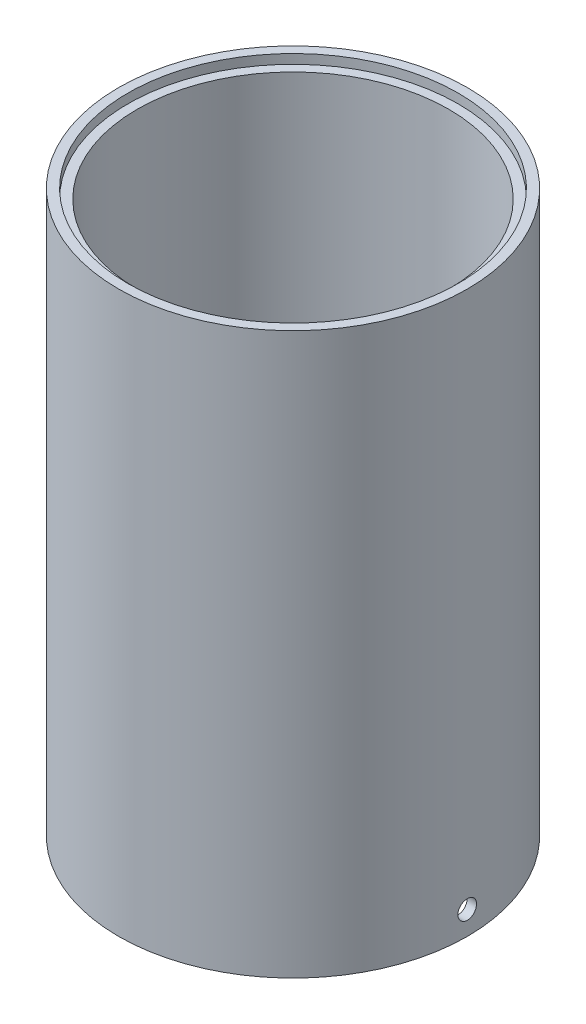
ISO-10303-21;
HEADER;
FILE_DESCRIPTION(('STEP AP214'),'2;1');
FILE_NAME('part.step','',(''),(''),'','','');
FILE_SCHEMA(('AUTOMOTIVE_DESIGN { 1 0 10303 214 1 1 1 1 }'));
ENDSEC;
DATA;
#1=APPLICATION_CONTEXT('core data for automotive mechanical design processes');
#2=APPLICATION_PROTOCOL_DEFINITION('international standard','automotive_design',2000,#1);
#3=PRODUCT_CONTEXT('',#1,'mechanical');
#4=PRODUCT('Part','Part','',(#3));
#5=PRODUCT_RELATED_PRODUCT_CATEGORY('part','',(#4));
#6=PRODUCT_DEFINITION_FORMATION('','',#4);
#7=PRODUCT_DEFINITION_CONTEXT('part definition',#1,'design');
#8=PRODUCT_DEFINITION('design','',#6,#7);
#9=PRODUCT_DEFINITION_SHAPE('','',#8);
#10=(LENGTH_UNIT() NAMED_UNIT(*) SI_UNIT(.MILLI.,.METRE.));
#11=(NAMED_UNIT(*) PLANE_ANGLE_UNIT() SI_UNIT($,.RADIAN.));
#12=(NAMED_UNIT(*) SI_UNIT($,.STERADIAN.) SOLID_ANGLE_UNIT());
#13=UNCERTAINTY_MEASURE_WITH_UNIT(LENGTH_MEASURE(1.E-05),#10,'distance_accuracy_value','');
#14=(GEOMETRIC_REPRESENTATION_CONTEXT(3) GLOBAL_UNCERTAINTY_ASSIGNED_CONTEXT((#13)) GLOBAL_UNIT_ASSIGNED_CONTEXT((#10,
#11,#12)) REPRESENTATION_CONTEXT('',''));
#15=CARTESIAN_POINT('',(0.,0.,0.));
#16=DIRECTION('',(0.,0.,1.));
#17=DIRECTION('',(1.,0.,0.));
#18=AXIS2_PLACEMENT_3D('',#15,#16,#17);
#19=CARTESIAN_POINT('',(0.,180.,0.));
#20=DIRECTION('',(0.,-1.,0.));
#21=DIRECTION('',(0.,0.,-1.));
#22=AXIS2_PLACEMENT_3D('',#19,#20,#21);
#23=CYLINDRICAL_SURFACE('',#22,56.);
#24=CARTESIAN_POINT('',(0.,180.,0.));
#25=DIRECTION('',(0.,1.,0.));
#26=DIRECTION('',(1.,0.,0.));
#27=AXIS2_PLACEMENT_3D('',#24,#25,#26);
#28=CIRCLE('',#27,56.);
#29=CARTESIAN_POINT('',(56.,180.,0.));
#30=VERTEX_POINT('',#29);
#31=EDGE_CURVE('E11',#30,#30,#28,.T.);
#32=ORIENTED_EDGE('',*,*,#31,.F.);
#33=EDGE_LOOP('',(#32));
#34=FACE_BOUND('',#33,.T.);
#35=CARTESIAN_POINT('',(0.,0.,0.));
#36=DIRECTION('',(0.,1.,0.));
#37=DIRECTION('',(1.,0.,0.));
#38=AXIS2_PLACEMENT_3D('',#35,#36,#37);
#39=CIRCLE('',#38,56.);
#40=CARTESIAN_POINT('',(56.,0.,0.));
#41=VERTEX_POINT('',#40);
#42=EDGE_CURVE('E54',#41,#41,#39,.T.);
#43=ORIENTED_EDGE('',*,*,#42,.T.);
#44=EDGE_LOOP('',(#43));
#45=FACE_BOUND('',#44,.T.);
#46=CARTESIAN_POINT('',(55.9195851200633,7.50000000000001,-3.));
#47=CARTESIAN_POINT('',(55.9195861991394,7.6683815451525,-2.99999257436234));
#48=CARTESIAN_POINT('',(55.9203538255063,7.83688210477019,-2.98577620779765));
#49=CARTESIAN_POINT('',(55.923341880392,8.16923372610874,-2.92926656847776));
#50=CARTESIAN_POINT('',(55.92556401517,8.33307909107233,-2.88694031964308));
#51=CARTESIAN_POINT('',(55.9312086591393,8.65125785475281,-2.77542728637137));
#52=CARTESIAN_POINT('',(55.9346305506156,8.80559610038525,-2.70625432246179));
#53=CARTESIAN_POINT('',(55.942288352116,9.10042921760216,-2.54303294824952));
#54=CARTESIAN_POINT('',(55.9465240714447,9.24092732055251,-2.44899036343413));
#55=CARTESIAN_POINT('',(55.9553377569819,9.50429373415512,-2.23858035887218));
#56=CARTESIAN_POINT('',(55.9599160617056,9.62714424746555,-2.12219067489981));
#57=CARTESIAN_POINT('',(55.9688958576349,9.85157628979778,-1.87043532175811));
#58=CARTESIAN_POINT('',(55.973297341576,9.95315694569171,-1.73506887397307));
#59=CARTESIAN_POINT('',(55.9814302152055,10.1322164281826,-1.44910726081878));
#60=CARTESIAN_POINT('',(55.9851612120952,10.2096811460079,-1.29850324888059));
#61=CARTESIAN_POINT('',(55.9915292180784,10.3382193297527,-0.986403819484196));
#62=CARTESIAN_POINT('',(55.9941662363528,10.3892930171481,-0.824908493439664));
#63=CARTESIAN_POINT('',(55.9980468447449,10.4635516566096,-0.495776651355437));
#64=CARTESIAN_POINT('',(55.9992917831112,10.4867635947705,-0.328146240058142));
#65=CARTESIAN_POINT('',(56.0002524712738,10.5047231313901,0.00863597379350962));
#66=CARTESIAN_POINT('',(55.9999682344735,10.49947097934,0.177787762999836));
#67=CARTESIAN_POINT('',(55.9979037343563,10.4606737809639,0.512628390747918));
#68=CARTESIAN_POINT('',(55.9961250066397,10.4271577758205,0.67832060500151));
#69=CARTESIAN_POINT('',(55.9912736197455,10.3328292989353,1.00172370948807));
#70=CARTESIAN_POINT('',(55.9882009545541,10.2720167003229,1.15943456262103));
#71=CARTESIAN_POINT('',(55.9811051229663,10.1247882299308,1.46249155238675));
#72=CARTESIAN_POINT('',(55.977081466258,10.0383591449501,1.60783125795446));
#73=CARTESIAN_POINT('',(55.9685367001476,9.84236074501021,1.88195001825096));
#74=CARTESIAN_POINT('',(55.964015586684,9.73279124111113,2.01072893774837));
#75=CARTESIAN_POINT('',(55.9549782612421,9.49345814435465,2.24823997219743));
#76=CARTESIAN_POINT('',(55.9504620625585,9.36366935291626,2.35694669738055));
#77=CARTESIAN_POINT('',(55.9419494133546,9.08767036766242,2.55103192249507));
#78=CARTESIAN_POINT('',(55.9379529629883,8.94146016897743,2.63641041550876));
#79=CARTESIAN_POINT('',(55.9309309332028,8.63675320028559,2.78141348552107));
#80=CARTESIAN_POINT('',(55.9279053909134,8.47825596068175,2.84103707762322));
#81=CARTESIAN_POINT('',(55.9231677640204,8.15348111024215,2.93282074287968));
#82=CARTESIAN_POINT('',(55.921455668076,7.98720356659842,2.96498105316545));
#83=CARTESIAN_POINT('',(55.9195401137446,7.65180936742008,3.00089377905491));
#84=CARTESIAN_POINT('',(55.9193347831588,7.48269649696021,3.00468144859401));
#85=CARTESIAN_POINT('',(55.9204510263271,7.14623765194812,2.98383340353376));
#86=CARTESIAN_POINT('',(55.9217725942712,6.97889167067525,2.95919779708634));
#87=CARTESIAN_POINT('',(55.9257919777113,6.65081614369008,2.8822317655449));
#88=CARTESIAN_POINT('',(55.9284889900035,6.49008279560059,2.82991750299585));
#89=CARTESIAN_POINT('',(55.9349546138976,6.1796779705534,2.69909552945861));
#90=CARTESIAN_POINT('',(55.9387232326293,6.03000656720364,2.62058764419305));
#91=CARTESIAN_POINT('',(55.9469118819793,5.74581212888393,2.43951659852235));
#92=CARTESIAN_POINT('',(55.9513325518547,5.61130419079465,2.33692977260415));
#93=CARTESIAN_POINT('',(55.9603248252139,5.36140678800475,2.11064744872912));
#94=CARTESIAN_POINT('',(55.964896429797,5.24601746259857,1.98695179699088));
#95=CARTESIAN_POINT('',(55.9736808084205,5.0375141345431,1.72181158632764));
#96=CARTESIAN_POINT('',(55.9778932126501,4.94442291451493,1.58034909749391));
#97=CARTESIAN_POINT('',(55.9854791775326,4.78331410145407,1.2837813163001));
#98=CARTESIAN_POINT('',(55.9888527422391,4.71529638724976,1.12867608987518));
#99=CARTESIAN_POINT('',(55.9943790793412,4.60630514274531,0.809310190853239));
#100=CARTESIAN_POINT('',(55.9965325077103,4.56531707873343,0.645054490034571));
#101=CARTESIAN_POINT('',(55.9993785046898,4.5115010486498,0.311980777816435));
#102=CARTESIAN_POINT('',(56.0000710831541,4.4986728926296,0.143162797198919));
#103=CARTESIAN_POINT('',(55.9999173715325,4.50154262353094,-0.194017406750738));
#104=CARTESIAN_POINT('',(55.9990730080731,4.51720479651206,-0.362379936090604));
#105=CARTESIAN_POINT('',(55.9959442446222,4.57653670675272,-0.694081407141251));
#106=CARTESIAN_POINT('',(55.9936598419604,4.62020649594721,-0.857420339536107));
#107=CARTESIAN_POINT('',(55.9879079439819,4.73430647480333,-1.17444486332068));
#108=CARTESIAN_POINT('',(55.9844404438054,4.8047367743896,-1.328130415054));
#109=CARTESIAN_POINT('',(55.9767121472276,4.97035274796358,-1.62149846000883));
#110=CARTESIAN_POINT('',(55.9724513741829,5.06553769312265,-1.76118136532988));
#111=CARTESIAN_POINT('',(55.963609839191,5.27809033864153,-2.02275839813577));
#112=CARTESIAN_POINT('',(55.9590287172377,5.39548325716799,-2.1446320207553));
#113=CARTESIAN_POINT('',(55.9500654034362,5.64909680451288,-2.36698111769812));
#114=CARTESIAN_POINT('',(55.9456832607393,5.78532205199465,-2.46745132738854));
#115=CARTESIAN_POINT('',(55.9376088919649,6.07285317243841,-2.64419587633827));
#116=CARTESIAN_POINT('',(55.9339173833432,6.22417448035095,-2.72044511070719));
#117=CARTESIAN_POINT('',(55.9276517302591,6.53737861942747,-2.84636327355684));
#118=CARTESIAN_POINT('',(55.9250762695871,6.69924874912649,-2.89606352873334));
#119=CARTESIAN_POINT('',(55.9220135445721,6.96843382819217,-2.95446761703488));
#120=CARTESIAN_POINT('',(55.9211069155477,7.07400611348309,-2.97152038773579));
#121=CARTESIAN_POINT('',(55.9198923612505,7.28636962832107,-2.99428892939189));
#122=CARTESIAN_POINT('',(55.9195844353827,7.39316085665667,-3.00000471161353));
#123=CARTESIAN_POINT('',(55.9195851200633,7.50000000000001,-3.));
#124=B_SPLINE_CURVE_WITH_KNOTS('',3,(#46,#47,#48,#49,#50,#51,#52,#53,#54,#55,#56,#57,#58,#59,
#60,#61,#62,#63,#64,#65,#66,#67,#68,#69,#70,#71,#72,#73,#74,#75,#76,#77,#78,#79,#80,#81,#82,#83,
#84,#85,#86,#87,#88,#89,#90,#91,#92,#93,#94,#95,#96,#97,#98,#99,#100,#101,#102,#103,#104,#105,
#106,#107,#108,#109,#110,#111,#112,#113,#114,#115,#116,#117,#118,#119,#120,#121,#122,#123),
.UNSPECIFIED.,.T.,.F.,(4,2,2,2,2,2,2,2,2,2,2,2,2,2,2,2,2,2,2,2,2,2,2,2,2,2,2,2,2,2,2,2,2,2,2,2,
2,2,4),(0.,0.504754624819107,1.01010243247589,1.51519043445124,2.02016022869491,
2.52563575540154,3.03113202781804,3.53692348206394,4.04271069159674,4.54800761375094,
5.05330010692592,5.55807404245851,6.06285032413203,6.56788742816513,7.0729286559475,
7.57860440960718,8.08428031321878,8.58997555273606,9.09566642578832,9.60072885697861,
10.1057893663884,10.6105552780974,11.1153245482969,11.620592013864,12.1258631605481,
12.631648376111,13.1374311473558,13.6429417394322,14.1484489216521,14.6533228639467,
15.1581977424398,15.6630746948393,16.1679367842857,16.6733756468204,17.1789386898066,
17.6850240487263,18.1905109213786,18.5107812054973,18.8310511713384),.UNSPECIFIED.);
#125=CARTESIAN_POINT('',(55.9195851200633,7.50000000000001,-3.));
#126=VERTEX_POINT('',#125);
#127=EDGE_CURVE('E91',#126,#126,#124,.T.);
#128=ORIENTED_EDGE('',*,*,#127,.F.);
#129=EDGE_LOOP('',(#128));
#130=FACE_BOUND('',#129,.T.);
#131=CARTESIAN_POINT('',(-56.,4.50000000000001,0.));
#132=CARTESIAN_POINT('',(-55.9999989266956,4.50000742546018,0.168381740663101));
#133=CARTESIAN_POINT('',(-55.9992324299297,4.5142238239215,0.336882495127751));
#134=CARTESIAN_POINT('',(-55.9962484107726,4.57073360146409,0.669234521329351));
#135=CARTESIAN_POINT('',(-55.9940291842471,4.61305995596199,0.833080096461581));
#136=CARTESIAN_POINT('',(-55.9883908518685,4.72457329837756,1.15125930440666));
#137=CARTESIAN_POINT('',(-55.9849723632475,4.79374647080814,1.30559778235477));
#138=CARTESIAN_POINT('',(-55.9773203742027,4.95696833596216,1.60043128828011));
#139=CARTESIAN_POINT('',(-55.9730870647231,5.05101120268104,1.74092954791739));
#140=CARTESIAN_POINT('',(-55.9642761671544,5.26142149107134,2.00429578235304));
#141=CARTESIAN_POINT('',(-55.9596982394627,5.37781111408086,2.12714600997348));
#142=CARTESIAN_POINT('',(-55.9507169851454,5.62956622564621,2.3515775015606));
#143=CARTESIAN_POINT('',(-55.9463136657007,5.76493249359363,2.45315789152424));
#144=CARTESIAN_POINT('',(-55.9381757028364,6.05089395140478,2.63221709767586));
#145=CARTESIAN_POINT('',(-55.9344414527646,6.20149801874268,2.70968175576443));
#146=CARTESIAN_POINT('',(-55.9280669591603,6.51359756860502,2.83821981375265));
#147=CARTESIAN_POINT('',(-55.9254267064169,6.67509295941716,2.88929343585127));
#148=CARTESIAN_POINT('',(-55.9215410710889,7.00422499076189,2.963551936281));
#149=CARTESIAN_POINT('',(-55.9202943391026,7.17185552761695,2.98676379588057));
#150=CARTESIAN_POINT('',(-55.9193322895748,7.50863798663921,3.00472313188408));
#151=CARTESIAN_POINT('',(-55.9196169585658,7.67778989541398,2.99947085860962));
#152=CARTESIAN_POINT('',(-55.9216843553835,8.01262998346627,2.96067347019866));
#153=CARTESIAN_POINT('',(-55.9234655390625,8.17832155268841,2.92715751822052));
#154=CARTESIAN_POINT('',(-55.9283227839895,8.50172339449743,2.83282937199361));
#155=CARTESIAN_POINT('',(-55.9313988513122,8.65943362963734,2.77201704968848));
#156=CARTESIAN_POINT('',(-55.9385009557555,8.96248987763196,2.62478914748724));
#157=CARTESIAN_POINT('',(-55.9425274853266,9.107829427734,2.53836028927506));
#158=CARTESIAN_POINT('',(-55.9510762029006,9.3819479736454,2.3423623712364));
#159=CARTESIAN_POINT('',(-55.9555983949474,9.51072683432419,2.23279312261012));
#160=CARTESIAN_POINT('',(-55.9646356235277,9.74823816417274,1.99346020460403));
#161=CARTESIAN_POINT('',(-55.9691506438853,9.85694519183304,1.86367128512431));
#162=CARTESIAN_POINT('',(-55.9776591810424,10.0510309658837,1.58767193676549));
#163=CARTESIAN_POINT('',(-55.9816526977009,10.1364097059643,1.44146150344477));
#164=CARTESIAN_POINT('',(-55.9886683805235,10.2814129528668,1.13675447615615));
#165=CARTESIAN_POINT('',(-55.9916905124501,10.3410365519473,0.978257449378708));
#166=CARTESIAN_POINT('',(-55.9964223518673,10.4328202965961,0.65348306079393));
#167=CARTESIAN_POINT('',(-55.9981320706297,10.4649806780345,0.487205765820988));
#168=CARTESIAN_POINT('',(-56.0000449536912,10.5008936715059,0.151811674387064));
#169=CARTESIAN_POINT('',(-56.0002499840264,10.5046814698568,-0.0173013442608167));
#170=CARTESIAN_POINT('',(-55.9991353406058,10.4838336295056,-0.353760516768518));
#171=CARTESIAN_POINT('',(-55.9978156726522,10.4591980989672,-0.521106677349591));
#172=CARTESIAN_POINT('',(-55.9938014512955,10.3822320388835,-0.849183056143772));
#173=CARTESIAN_POINT('',(-55.9911076965175,10.3299175957813,-1.00991705879575));
#174=CARTESIAN_POINT('',(-55.9846485221795,10.1990950414225,-1.32032311287043));
#175=CARTESIAN_POINT('',(-55.9808830955325,10.1205867569441,-1.46999509113118));
#176=CARTESIAN_POINT('',(-55.9726993891994,9.93951513066038,-1.75418990890715));
#177=CARTESIAN_POINT('',(-55.9682804715678,9.83692822491065,-1.88869771627319));
#178=CARTESIAN_POINT('',(-55.9592894782092,9.61064581530907,-2.13859481801946));
#179=CARTESIAN_POINT('',(-55.9547174013622,9.48695015706042,-2.253983972547));
#180=CARTESIAN_POINT('',(-55.9459300593535,9.22181002348173,-2.46248694879148));
#181=CARTESIAN_POINT('',(-55.9417151619369,9.08034761890842,-2.55557798861543));
#182=CARTESIAN_POINT('',(-55.9341232811861,8.78378005263501,-2.71668648512854));
#183=CARTESIAN_POINT('',(-55.9307462938029,8.62867495686382,-2.78470406297808));
#184=CARTESIAN_POINT('',(-55.9252136798895,8.30930896119202,-2.89369521337941));
#185=CARTESIAN_POINT('',(-55.9230573997392,8.14505301290993,-2.9346832606646));
#186=CARTESIAN_POINT('',(-55.9202075289065,7.81197878019857,-2.98849917338099));
#187=CARTESIAN_POINT('',(-55.9195139282897,7.64316052676376,-3.00132723007115));
#188=CARTESIAN_POINT('',(-55.9196678757316,7.30598050734815,-2.9984572168664));
#189=CARTESIAN_POINT('',(-55.9205134879221,7.13761843430916,-2.982794979235));
#190=CARTESIAN_POINT('',(-55.9236464648147,6.80591789155741,-2.92346310056789));
#191=CARTESIAN_POINT('',(-55.9259338322324,6.64257943130738,-2.87979340677937));
#192=CARTESIAN_POINT('',(-55.9316920782378,6.32555582740604,-2.76569378859363));
#193=CARTESIAN_POINT('',(-55.9351629616666,6.17187072324427,-2.69526375473465));
#194=CARTESIAN_POINT('',(-55.942896962949,5.87850346201303,-2.52964845055946));
#195=CARTESIAN_POINT('',(-55.9471600574926,5.73882089311893,-2.43446390858724));
#196=CARTESIAN_POINT('',(-55.9560041790482,5.47724382086984,-2.22191169821933));
#197=CARTESIAN_POINT('',(-55.9605855649934,5.35536989673781,-2.10451872004693));
#198=CARTESIAN_POINT('',(-55.9695472131291,5.13302021941603,-1.85090493052439));
#199=CARTESIAN_POINT('',(-55.9739274256367,5.03254973008198,-1.7146795011654));
#200=CARTESIAN_POINT('',(-55.9819965731948,4.85580488961137,-1.42714824101632));
#201=CARTESIAN_POINT('',(-55.9856847909074,4.779555590605,-1.27582700767108));
#202=CARTESIAN_POINT('',(-55.9919439644898,4.65363728607145,-0.962623028387192));
#203=CARTESIAN_POINT('',(-55.9945162364112,4.60393695485175,-0.800752983491949));
#204=CARTESIAN_POINT('',(-55.9975749681861,4.54553264618131,-0.531567700012619));
#205=CARTESIAN_POINT('',(-55.9984803467708,4.52847977646863,-0.42599510993223));
#206=CARTESIAN_POINT('',(-55.9996932028918,4.50571110322948,-0.213630984065455));
#207=CARTESIAN_POINT('',(-56.0000006810195,4.49999528849107,-0.106839449484666));
#208=CARTESIAN_POINT('',(-56.,4.50000000000001,0.));
#209=B_SPLINE_CURVE_WITH_KNOTS('',3,(#131,#132,#133,#134,#135,#136,#137,#138,#139,#140,#141,
#142,#143,#144,#145,#146,#147,#148,#149,#150,#151,#152,#153,#154,#155,#156,#157,#158,#159,#160,
#161,#162,#163,#164,#165,#166,#167,#168,#169,#170,#171,#172,#173,#174,#175,#176,#177,#178,#179,
#180,#181,#182,#183,#184,#185,#186,#187,#188,#189,#190,#191,#192,#193,#194,#195,#196,#197,#198,
#199,#200,#201,#202,#203,#204,#205,#206,#207,#208),.UNSPECIFIED.,.T.,.F.,(4,2,2,2,2,2,2,2,2,2,2,
2,2,2,2,2,2,2,2,2,2,2,2,2,2,2,2,2,2,2,2,2,2,2,2,2,2,2,4),(0.,0.504755211990766,1.01010359400553,
1.51519226566308,2.02016271929367,2.52563747787361,3.03113300294088,3.53692474201765,
4.0427122225181,4.54800950336702,5.05330234049667,5.55807444109352,6.0628489097692,
6.56788548695203,7.07292618482978,7.57860270359897,8.08427935914152,8.58997383583343,
9.09566396928404,9.60072686607279,10.1057878408739,10.6105556060188,11.1153267092951,
11.6205938691903,12.1258647249449,12.6316496327128,13.1374320963866,13.6429434852683,
14.1484514407727,14.6533240580869,15.1581976263453,15.6630732597846,16.1679340401097,
16.6733736878813,17.1789374978605,17.6850225258039,18.1905090868204,18.5107802878065,
18.8310511720558),.UNSPECIFIED.);
#210=CARTESIAN_POINT('',(-56.,4.50000000000001,0.));
#211=VERTEX_POINT('',#210);
#212=EDGE_CURVE('E96',#211,#211,#209,.T.);
#213=ORIENTED_EDGE('',*,*,#212,.F.);
#214=EDGE_LOOP('',(#213));
#215=FACE_BOUND('',#214,.T.);
#216=ADVANCED_FACE('F41',(#34,#45,#130,#215),#23,.T.);
#217=CARTESIAN_POINT('',(0.,15.,0.));
#218=DIRECTION('',(0.,-1.,0.));
#219=DIRECTION('',(0.,0.,-1.));
#220=AXIS2_PLACEMENT_3D('',#217,#218,#219);
#221=CYLINDRICAL_SURFACE('',#220,53.);
#222=CARTESIAN_POINT('',(0.,15.,0.));
#223=DIRECTION('',(0.,-1.,0.));
#224=DIRECTION('',(0.,0.,-1.));
#225=AXIS2_PLACEMENT_3D('',#222,#223,#224);
#226=CIRCLE('',#225,53.);
#227=CARTESIAN_POINT('',(0.,15.,-53.));
#228=VERTEX_POINT('',#227);
#229=EDGE_CURVE('E70',#228,#228,#226,.T.);
#230=ORIENTED_EDGE('',*,*,#229,.F.);
#231=EDGE_LOOP('',(#230));
#232=FACE_BOUND('',#231,.T.);
#233=CARTESIAN_POINT('',(0.,0.,0.));
#234=DIRECTION('',(0.,-1.,0.));
#235=DIRECTION('',(0.,0.,-1.));
#236=AXIS2_PLACEMENT_3D('',#233,#234,#235);
#237=CIRCLE('',#236,53.);
#238=CARTESIAN_POINT('',(0.,0.,-53.));
#239=VERTEX_POINT('',#238);
#240=EDGE_CURVE('E102',#239,#239,#237,.T.);
#241=ORIENTED_EDGE('',*,*,#240,.T.);
#242=EDGE_LOOP('',(#241));
#243=FACE_BOUND('',#242,.T.);
#244=CARTESIAN_POINT('',(52.9150262212918,7.50000000000001,-3.));
#245=CARTESIAN_POINT('',(52.9150273604313,7.33163356837681,-2.99999258025465));
#246=CARTESIAN_POINT('',(52.9158384297024,7.16314849174317,-2.98577875505398));
#247=CARTESIAN_POINT('',(52.918995545167,6.83082844752534,-2.92927980011255));
#248=CARTESIAN_POINT('',(52.9213433889195,6.66699916024435,-2.88696179617891));
#249=CARTESIAN_POINT('',(52.9273072595175,6.3488526352884,-2.77547194940067));
#250=CARTESIAN_POINT('',(52.9309226283052,6.194530510589,-2.70631403897356));
#251=CARTESIAN_POINT('',(52.9390133433821,5.89972644680121,-2.54312949053879));
#252=CARTESIAN_POINT('',(52.9434884896544,5.75924130018246,-2.44910863468459));
#253=CARTESIAN_POINT('',(52.9528009030661,5.49588123353891,-2.23873658393099));
#254=CARTESIAN_POINT('',(52.9576385652274,5.37302596178104,-2.12236080729138));
#255=CARTESIAN_POINT('',(52.9671272115173,5.14858092972625,-1.87063245164346));
#256=CARTESIAN_POINT('',(52.9717781879366,5.04699204691049,-1.73527908997789));
#257=CARTESIAN_POINT('',(52.9803726214822,4.86790606764673,-1.44933059192975));
#258=CARTESIAN_POINT('',(52.9843156136657,4.79042477868759,-1.2987255403385));
#259=CARTESIAN_POINT('',(52.99104568713,4.66185471391847,-0.986618453866821));
#260=CARTESIAN_POINT('',(52.993832778972,4.61076569696509,-0.82511651856532));
#261=CARTESIAN_POINT('',(52.9979343058883,4.53648368973046,-0.495985404787353));
#262=CARTESIAN_POINT('',(52.9992503313444,4.51326057139841,-0.328363046078753));
#263=CARTESIAN_POINT('',(53.0002667769246,4.49527656999879,0.00840552703675068));
#264=CARTESIAN_POINT('',(52.9999672125157,4.50051541444759,0.177551726839524));
#265=CARTESIAN_POINT('',(52.9977875673194,4.53928170431074,0.512362507501287));
#266=CARTESIAN_POINT('',(52.9959092977446,4.57277673221018,0.678030855267412));
#267=CARTESIAN_POINT('',(52.9907858410517,4.66705430841181,1.0013897470302));
#268=CARTESIAN_POINT('',(52.9875406470209,4.72783699471058,1.15908025067757));
#269=CARTESIAN_POINT('',(52.9800456905947,4.87500132612755,1.46211142843441));
#270=CARTESIAN_POINT('',(52.9757953504196,4.9613977018207,1.60744493390607));
#271=CARTESIAN_POINT('',(52.9667685998258,5.15732620094621,1.88155831381257));
#272=CARTESIAN_POINT('',(52.961992184588,5.26685853632342,2.01033803658344));
#273=CARTESIAN_POINT('',(52.9524430987522,5.5061329091058,2.24787740353388));
#274=CARTESIAN_POINT('',(52.9476704428032,5.63590307745846,2.35660871389641));
#275=CARTESIAN_POINT('',(52.9386736518171,5.91187072829673,2.55074640915817));
#276=CARTESIAN_POINT('',(52.9344495169591,6.05806821615084,2.63615278643472));
#277=CARTESIAN_POINT('',(52.9270266541665,6.36275805425415,2.78121399758401));
#278=CARTESIAN_POINT('',(52.92382797121,6.52125094342279,2.84086770193878));
#279=CARTESIAN_POINT('',(52.9188183926683,6.84602456447285,2.9327109744884));
#280=CARTESIAN_POINT('',(52.9170074837026,7.01230522125046,2.96490080748225));
#281=CARTESIAN_POINT('',(52.9149801641933,7.3476872962931,3.00086741435595));
#282=CARTESIAN_POINT('',(52.9147615450637,7.51678448124295,3.0046835441411));
#283=CARTESIAN_POINT('',(52.9159376915038,7.85321667366832,2.98389718465985));
#284=CARTESIAN_POINT('',(52.917332450208,8.02055168863946,2.95929481632451));
#285=CARTESIAN_POINT('',(52.9215761444462,8.34859859446302,2.88240249813596));
#286=CARTESIAN_POINT('',(52.9244241309001,8.509314734059,2.8301306179753));
#287=CARTESIAN_POINT('',(52.931252504561,8.81969276166786,2.69940137712667));
#288=CARTESIAN_POINT('',(52.9352329001866,8.96935456749199,2.62094382177264));
#289=CARTESIAN_POINT('',(52.9438828670737,9.25355650014985,2.43996956263592));
#290=CARTESIAN_POINT('',(52.9485531925628,9.38807979046122,2.33742645535512));
#291=CARTESIAN_POINT('',(52.9580540237294,9.6380165874289,2.11123041565068));
#292=CARTESIAN_POINT('',(52.9628845307028,9.75342993943167,1.98757731240384));
#293=CARTESIAN_POINT('',(52.972167791449,9.96200329479473,1.72250212734608));
#294=CARTESIAN_POINT('',(52.97662010959,10.0551378537518,1.58106000738723));
#295=CARTESIAN_POINT('',(52.984639013747,10.2163358484502,1.28452283158235));
#296=CARTESIAN_POINT('',(52.9882056044263,10.2843994161849,1.1294278476211));
#297=CARTESIAN_POINT('',(52.9940490567566,10.3934789766508,0.810081617850341));
#298=CARTESIAN_POINT('',(52.9963266903084,10.4345111597319,0.645835916888517));
#299=CARTESIAN_POINT('',(52.9993386385644,10.4884162000308,0.312773227123358));
#300=CARTESIAN_POINT('',(53.000072965217,10.50128927526,0.143956273721507));
#301=CARTESIAN_POINT('',(52.9999155944464,10.498508608982,-0.193204653077941));
#302=CARTESIAN_POINT('',(52.9990261692912,10.4828947319577,-0.361548957765347));
#303=CARTESIAN_POINT('',(52.9957258643666,10.423665914928,-0.693221787307539));
#304=CARTESIAN_POINT('',(52.9933149818197,10.3800509238049,-0.856550303005162));
#305=CARTESIAN_POINT('',(52.9872428706777,10.2660665675785,-1.17356232281039));
#306=CARTESIAN_POINT('',(52.9835816410368,10.1956971800963,-1.32724581885024));
#307=CARTESIAN_POINT('',(52.9754202481447,10.0302076543253,-1.62062097963172));
#308=CARTESIAN_POINT('',(52.9709201086442,9.93508821671827,-1.76031304032033));
#309=CARTESIAN_POINT('',(52.9615798843919,9.72265315780174,-2.02194096205241));
#310=CARTESIAN_POINT('',(52.9567393696137,9.60530912951244,-2.14385374109935));
#311=CARTESIAN_POINT('',(52.9472671842796,9.35178628830827,-2.3662899211126));
#312=CARTESIAN_POINT('',(52.9426355652607,9.21560286084643,-2.46680806628934));
#313=CARTESIAN_POINT('',(52.9340998012704,8.9281356569574,-2.64366238103034));
#314=CARTESIAN_POINT('',(52.9301964619694,8.77683543804682,-2.71997183393617));
#315=CARTESIAN_POINT('',(52.9235697415207,8.46365991579547,-2.84601241696786));
#316=CARTESIAN_POINT('',(52.9208449732172,8.30179730396841,-2.89577480867915));
#317=CARTESIAN_POINT('',(52.9176010588627,8.03244722101439,-2.95431541205156));
#318=CARTESIAN_POINT('',(52.916639781308,7.92670264634356,-2.97142511975797));
#319=CARTESIAN_POINT('',(52.915352000845,7.71398802517196,-2.99426976545307));
#320=CARTESIAN_POINT('',(52.9150254972258,7.60701798004355,-3.00000471617859));
#321=CARTESIAN_POINT('',(52.9150262212918,7.50000000000001,-3.));
#322=B_SPLINE_CURVE_WITH_KNOTS('',3,(#244,#245,#246,#247,#248,#249,#250,#251,#252,#253,#254,
#255,#256,#257,#258,#259,#260,#261,#262,#263,#264,#265,#266,#267,#268,#269,#270,#271,#272,#273,
#274,#275,#276,#277,#278,#279,#280,#281,#282,#283,#284,#285,#286,#287,#288,#289,#290,#291,#292,
#293,#294,#295,#296,#297,#298,#299,#300,#301,#302,#303,#304,#305,#306,#307,#308,#309,#310,#311,
#312,#313,#314,#315,#316,#317,#318,#319,#320,#321),.UNSPECIFIED.,.T.,.F.,(4,2,2,2,2,2,2,2,2,2,2,
2,2,2,2,2,2,2,2,2,2,2,2,2,2,2,2,2,2,2,2,2,2,2,2,2,2,2,4),(0.,0.504708625367446,1.01000866389998,
1.51504675461233,2.01996749625581,2.52544666642927,3.03094668927592,3.53677747627023,
4.04260364146019,4.54788242334746,5.0531563679033,5.55785141317156,6.06254901076502,
6.56753742767056,7.07253047089538,7.57823182499809,8.08393334436614,8.58965704166288,
9.09537586285735,9.60039309281452,10.1054081737473,10.6100938585764,11.1147832953561,
11.6200285955492,12.1252779844081,12.6311016879518,13.1369227284024,13.6424405330635,
14.1479544239253,14.6527614439753,15.1575693855802,15.6623777494349,16.1671718235576,
16.6726155226795,17.178183245772,17.6843069868371,18.1898333980133,18.5106393779074,
18.8314449985803),.UNSPECIFIED.);
#323=CARTESIAN_POINT('',(52.9150262212918,7.50000000000001,-3.));
#324=VERTEX_POINT('',#323);
#325=EDGE_CURVE('E71',#324,#324,#322,.T.);
#326=ORIENTED_EDGE('',*,*,#325,.F.);
#327=EDGE_LOOP('',(#326));
#328=FACE_BOUND('',#327,.T.);
#329=CARTESIAN_POINT('',(-52.9150262212918,7.50000000000001,-3.));
#330=CARTESIAN_POINT('',(-52.9150273604313,7.6683664316232,-2.99999258025465));
#331=CARTESIAN_POINT('',(-52.9158384297024,7.83685150825684,-2.98577875505398));
#332=CARTESIAN_POINT('',(-52.918995545167,8.16917155247468,-2.92927980011255));
#333=CARTESIAN_POINT('',(-52.9213433889195,8.33300083975567,-2.88696179617891));
#334=CARTESIAN_POINT('',(-52.9273072595175,8.65114736471162,-2.77547194940067));
#335=CARTESIAN_POINT('',(-52.9309226283052,8.80546948941102,-2.70631403897356));
#336=CARTESIAN_POINT('',(-52.9390133433821,9.1002735531988,-2.54312949053879));
#337=CARTESIAN_POINT('',(-52.9434884896544,9.24075869981755,-2.44910863468459));
#338=CARTESIAN_POINT('',(-52.9528009030661,9.50411876646111,-2.23873658393099));
#339=CARTESIAN_POINT('',(-52.9576385652274,9.62697403821898,-2.12236080729138));
#340=CARTESIAN_POINT('',(-52.9671272115173,9.85141907027376,-1.87063245164346));
#341=CARTESIAN_POINT('',(-52.9717781879366,9.95300795308952,-1.73527908997789));
#342=CARTESIAN_POINT('',(-52.9803726214822,10.1320939323533,-1.44933059192975));
#343=CARTESIAN_POINT('',(-52.9843156136657,10.2095752213124,-1.29872554033849));
#344=CARTESIAN_POINT('',(-52.99104568713,10.3381452860815,-0.98661845386682));
#345=CARTESIAN_POINT('',(-52.993832778972,10.3892343030349,-0.825116518565319));
#346=CARTESIAN_POINT('',(-52.9979343058883,10.4635163102696,-0.495985404787351));
#347=CARTESIAN_POINT('',(-52.9992503313444,10.4867394286016,-0.328363046078752));
#348=CARTESIAN_POINT('',(-53.0002667769246,10.5047234300012,0.00840552703675119));
#349=CARTESIAN_POINT('',(-52.9999672125157,10.4994845855524,0.177551726839524));
#350=CARTESIAN_POINT('',(-52.9977875673194,10.4607182956893,0.512362507501288));
#351=CARTESIAN_POINT('',(-52.9959092977446,10.4272232677898,0.678030855267413));
#352=CARTESIAN_POINT('',(-52.9907858410517,10.3329456915882,1.0013897470302));
#353=CARTESIAN_POINT('',(-52.9875406470209,10.2721630052894,1.15908025067757));
#354=CARTESIAN_POINT('',(-52.9800456905947,10.1249986738725,1.46211142843441));
#355=CARTESIAN_POINT('',(-52.9757953504196,10.0386022981793,1.60744493390607));
#356=CARTESIAN_POINT('',(-52.9667685998258,9.84267379905381,1.88155831381257));
#357=CARTESIAN_POINT('',(-52.961992184588,9.7331414636766,2.01033803658344));
#358=CARTESIAN_POINT('',(-52.9524430987522,9.49386709089421,2.24787740353388));
#359=CARTESIAN_POINT('',(-52.9476704428032,9.36409692254156,2.35660871389641));
#360=CARTESIAN_POINT('',(-52.9386736518171,9.08812927170329,2.55074640915817));
#361=CARTESIAN_POINT('',(-52.9344495169591,8.94193178384918,2.63615278643471));
#362=CARTESIAN_POINT('',(-52.9270266541665,8.63724194574587,2.78121399758401));
#363=CARTESIAN_POINT('',(-52.92382797121,8.47874905657723,2.84086770193878));
#364=CARTESIAN_POINT('',(-52.9188183926683,8.15397543552717,2.9327109744884));
#365=CARTESIAN_POINT('',(-52.9170074837026,7.98769477874955,2.96490080748225));
#366=CARTESIAN_POINT('',(-52.9149801641933,7.65231270370692,3.00086741435595));
#367=CARTESIAN_POINT('',(-52.9147615450637,7.48321551875707,3.0046835441411));
#368=CARTESIAN_POINT('',(-52.9159376915038,7.14678332633169,2.98389718465985));
#369=CARTESIAN_POINT('',(-52.917332450208,6.97944831136055,2.95929481632451));
#370=CARTESIAN_POINT('',(-52.9215761444462,6.651401405537,2.88240249813596));
#371=CARTESIAN_POINT('',(-52.9244241309001,6.49068526594102,2.8301306179753));
#372=CARTESIAN_POINT('',(-52.931252504561,6.18030723833215,2.69940137712667));
#373=CARTESIAN_POINT('',(-52.9352329001866,6.03064543250803,2.62094382177264));
#374=CARTESIAN_POINT('',(-52.9438828670737,5.74644349985017,2.43996956263592));
#375=CARTESIAN_POINT('',(-52.9485531925628,5.6119202095388,2.33742645535511));
#376=CARTESIAN_POINT('',(-52.9580540237294,5.36198341257112,2.11123041565068));
#377=CARTESIAN_POINT('',(-52.9628845307028,5.24657006056835,1.98757731240384));
#378=CARTESIAN_POINT('',(-52.972167791449,5.03799670520529,1.72250212734607));
#379=CARTESIAN_POINT('',(-52.97662010959,4.94486214624819,1.58106000738723));
#380=CARTESIAN_POINT('',(-52.984639013747,4.78366415154983,1.28452283158235));
#381=CARTESIAN_POINT('',(-52.9882056044263,4.71560058381509,1.12942784762109));
#382=CARTESIAN_POINT('',(-52.9940490567566,4.60652102334919,0.810081617850339));
#383=CARTESIAN_POINT('',(-52.9963266903084,4.56548884026808,0.645835916888515));
#384=CARTESIAN_POINT('',(-52.9993386385644,4.51158379996925,0.312773227123357));
#385=CARTESIAN_POINT('',(-53.000072965217,4.49871072474,0.143956273721506));
#386=CARTESIAN_POINT('',(-52.9999155944464,4.50149139101804,-0.193204653077942));
#387=CARTESIAN_POINT('',(-52.9990261692912,4.51710526804227,-0.361548957765349));
#388=CARTESIAN_POINT('',(-52.9957258643666,4.57633408507204,-0.69322178730754));
#389=CARTESIAN_POINT('',(-52.9933149818197,4.61994907619512,-0.856550303005162));
#390=CARTESIAN_POINT('',(-52.9872428706777,4.73393343242153,-1.17356232281039));
#391=CARTESIAN_POINT('',(-52.9835816410368,4.80430281990369,-1.32724581885024));
#392=CARTESIAN_POINT('',(-52.9754202481447,4.96979234567472,-1.62062097963172));
#393=CARTESIAN_POINT('',(-52.9709201086442,5.06491178328175,-1.76031304032032));
#394=CARTESIAN_POINT('',(-52.9615798843919,5.27734684219828,-2.02194096205241));
#395=CARTESIAN_POINT('',(-52.9567393696137,5.39469087048757,-2.14385374109935));
#396=CARTESIAN_POINT('',(-52.9472671842796,5.64821371169174,-2.3662899211126));
#397=CARTESIAN_POINT('',(-52.9426355652607,5.78439713915359,-2.46680806628934));
#398=CARTESIAN_POINT('',(-52.9340998012704,6.07186434304262,-2.64366238103034));
#399=CARTESIAN_POINT('',(-52.9301964619694,6.22316456195319,-2.71997183393618));
#400=CARTESIAN_POINT('',(-52.9235697415207,6.53634008420455,-2.84601241696786));
#401=CARTESIAN_POINT('',(-52.9208449732172,6.69820269603161,-2.89577480867915));
#402=CARTESIAN_POINT('',(-52.9176010588627,6.96755277898562,-2.95431541205156));
#403=CARTESIAN_POINT('',(-52.916639781308,7.07329735365646,-2.97142511975797));
#404=CARTESIAN_POINT('',(-52.915352000845,7.28601197482805,-2.99426976545307));
#405=CARTESIAN_POINT('',(-52.9150254972258,7.39298201995647,-3.00000471617859));
#406=CARTESIAN_POINT('',(-52.9150262212918,7.50000000000001,-3.));
#407=B_SPLINE_CURVE_WITH_KNOTS('',3,(#329,#330,#331,#332,#333,#334,#335,#336,#337,#338,#339,
#340,#341,#342,#343,#344,#345,#346,#347,#348,#349,#350,#351,#352,#353,#354,#355,#356,#357,#358,
#359,#360,#361,#362,#363,#364,#365,#366,#367,#368,#369,#370,#371,#372,#373,#374,#375,#376,#377,
#378,#379,#380,#381,#382,#383,#384,#385,#386,#387,#388,#389,#390,#391,#392,#393,#394,#395,#396,
#397,#398,#399,#400,#401,#402,#403,#404,#405,#406),.UNSPECIFIED.,.T.,.F.,(4,2,2,2,2,2,2,2,2,2,2,
2,2,2,2,2,2,2,2,2,2,2,2,2,2,2,2,2,2,2,2,2,2,2,2,2,2,2,4),(0.,0.504708625367447,1.01000866389998,
1.51504675461233,2.01996749625581,2.52544666642927,3.03094668927592,3.53677747627023,
4.04260364146019,4.54788242334746,5.0531563679033,5.55785141317156,6.06254901076502,
6.56753742767056,7.07253047089538,7.57823182499809,8.08393334436614,8.58965704166288,
9.09537586285735,9.60039309281453,10.1054081737473,10.6100938585764,11.1147832953561,
11.6200285955492,12.1252779844081,12.6311016879518,13.1369227284024,13.6424405330635,
14.1479544239253,14.6527614439753,15.1575693855802,15.6623777494349,16.1671718235576,
16.6726155226795,17.178183245772,17.6843069868371,18.1898333980133,18.5106393779074,
18.8314449985803),.UNSPECIFIED.);
#408=CARTESIAN_POINT('',(-52.9150262212918,7.50000000000001,-3.));
#409=VERTEX_POINT('',#408);
#410=EDGE_CURVE('E45',#409,#409,#407,.T.);
#411=ORIENTED_EDGE('',*,*,#410,.F.);
#412=EDGE_LOOP('',(#411));
#413=FACE_BOUND('',#412,.T.);
#414=ADVANCED_FACE('F76',(#232,#243,#328,#413),#221,.F.);
#415=CARTESIAN_POINT('',(0.,180.,0.));
#416=DIRECTION('',(0.,-1.,0.));
#417=DIRECTION('',(0.,0.,-1.));
#418=AXIS2_PLACEMENT_3D('',#415,#416,#417);
#419=CYLINDRICAL_SURFACE('',#418,50.);
#420=CARTESIAN_POINT('',(0.,177.,0.));
#421=DIRECTION('',(0.,1.,0.));
#422=DIRECTION('',(0.,0.,1.));
#423=AXIS2_PLACEMENT_3D('',#420,#421,#422);
#424=CIRCLE('',#423,50.);
#425=CARTESIAN_POINT('',(0.,177.,-50.));
#426=VERTEX_POINT('',#425);
#427=EDGE_CURVE('E59',#426,#426,#424,.T.);
#428=CARTESIAN_POINT('',(0.,15.,0.));
#429=DIRECTION('',(0.,-1.,0.));
#430=DIRECTION('',(0.,0.,-1.));
#431=AXIS2_PLACEMENT_3D('',#428,#429,#430);
#432=CIRCLE('',#431,50.);
#433=CARTESIAN_POINT('',(0.,15.,-50.));
#434=VERTEX_POINT('',#433);
#435=EDGE_CURVE('E68',#434,#434,#432,.T.);
#436=CARTESIAN_POINT('',(0.,177.,-50.));
#437=CARTESIAN_POINT('',(0.,175.3125,-50.));
#438=CARTESIAN_POINT('',(0.,173.625,-50.));
#439=CARTESIAN_POINT('',(0.,170.25,-50.));
#440=CARTESIAN_POINT('',(0.,168.5625,-50.));
#441=CARTESIAN_POINT('',(0.,165.1875,-50.));
#442=CARTESIAN_POINT('',(0.,163.5,-50.));
#443=CARTESIAN_POINT('',(0.,160.125,-50.));
#444=CARTESIAN_POINT('',(0.,158.4375,-50.));
#445=CARTESIAN_POINT('',(0.,155.0625,-50.));
#446=CARTESIAN_POINT('',(0.,153.375,-50.));
#447=CARTESIAN_POINT('',(0.,150.,-50.));
#448=CARTESIAN_POINT('',(0.,148.3125,-50.));
#449=CARTESIAN_POINT('',(0.,144.9375,-50.));
#450=CARTESIAN_POINT('',(0.,143.25,-50.));
#451=CARTESIAN_POINT('',(0.,139.875,-50.));
#452=CARTESIAN_POINT('',(0.,138.1875,-50.));
#453=CARTESIAN_POINT('',(0.,134.8125,-50.));
#454=CARTESIAN_POINT('',(0.,133.125,-50.));
#455=CARTESIAN_POINT('',(0.,129.75,-50.));
#456=CARTESIAN_POINT('',(0.,128.0625,-50.));
#457=CARTESIAN_POINT('',(0.,124.6875,-50.));
#458=CARTESIAN_POINT('',(0.,123.,-50.));
#459=CARTESIAN_POINT('',(0.,119.625,-50.));
#460=CARTESIAN_POINT('',(0.,117.9375,-50.));
#461=CARTESIAN_POINT('',(0.,114.5625,-50.));
#462=CARTESIAN_POINT('',(0.,112.875,-50.));
#463=CARTESIAN_POINT('',(0.,109.5,-50.));
#464=CARTESIAN_POINT('',(0.,107.8125,-50.));
#465=CARTESIAN_POINT('',(0.,104.4375,-50.));
#466=CARTESIAN_POINT('',(0.,102.75,-50.));
#467=CARTESIAN_POINT('',(0.,99.375,-50.));
#468=CARTESIAN_POINT('',(0.,97.6875,-50.));
#469=CARTESIAN_POINT('',(0.,94.3125,-50.));
#470=CARTESIAN_POINT('',(0.,92.625,-50.));
#471=CARTESIAN_POINT('',(0.,89.25,-50.));
#472=CARTESIAN_POINT('',(0.,87.5625,-50.));
#473=CARTESIAN_POINT('',(0.,84.1875,-50.));
#474=CARTESIAN_POINT('',(0.,82.5,-50.));
#475=CARTESIAN_POINT('',(0.,79.125,-50.));
#476=CARTESIAN_POINT('',(0.,77.4375,-50.));
#477=CARTESIAN_POINT('',(0.,74.0625,-50.));
#478=CARTESIAN_POINT('',(0.,72.375,-50.));
#479=CARTESIAN_POINT('',(0.,69.,-50.));
#480=CARTESIAN_POINT('',(0.,67.3125,-50.));
#481=CARTESIAN_POINT('',(0.,63.9375,-50.));
#482=CARTESIAN_POINT('',(0.,62.25,-50.));
#483=CARTESIAN_POINT('',(0.,58.875,-50.));
#484=CARTESIAN_POINT('',(0.,57.1875,-50.));
#485=CARTESIAN_POINT('',(0.,53.8125,-50.));
#486=CARTESIAN_POINT('',(0.,52.125,-50.));
#487=CARTESIAN_POINT('',(0.,48.75,-50.));
#488=CARTESIAN_POINT('',(0.,47.0625,-50.));
#489=CARTESIAN_POINT('',(0.,43.6875,-50.));
#490=CARTESIAN_POINT('',(0.,42.,-50.));
#491=CARTESIAN_POINT('',(0.,38.625,-50.));
#492=CARTESIAN_POINT('',(0.,36.9375,-50.));
#493=CARTESIAN_POINT('',(0.,33.5625,-50.));
#494=CARTESIAN_POINT('',(0.,31.875,-50.));
#495=CARTESIAN_POINT('',(0.,28.5,-50.));
#496=CARTESIAN_POINT('',(0.,26.8125,-50.));
#497=CARTESIAN_POINT('',(0.,23.4375,-50.));
#498=CARTESIAN_POINT('',(0.,21.75,-50.));
#499=CARTESIAN_POINT('',(0.,18.375,-50.));
#500=CARTESIAN_POINT('',(0.,16.6875,-50.));
#501=CARTESIAN_POINT('',(0.,15.,-50.));
#502=B_SPLINE_CURVE_WITH_KNOTS('',3,(#436,#437,#438,#439,#440,#441,#442,#443,#444,#445,#446,
#447,#448,#449,#450,#451,#452,#453,#454,#455,#456,#457,#458,#459,#460,#461,#462,#463,#464,#465,
#466,#467,#468,#469,#470,#471,#472,#473,#474,#475,#476,#477,#478,#479,#480,#481,#482,#483,#484,
#485,#486,#487,#488,#489,#490,#491,#492,#493,#494,#495,#496,#497,#498,#499,#500,#501),
.UNSPECIFIED.,.F.,.F.,(4,2,2,2,2,2,2,2,2,2,2,2,2,2,2,2,2,2,2,2,2,2,2,2,2,2,2,2,2,2,2,2,4),(0.,
5.0625,10.125,15.1875,20.25,25.3125,30.375,35.4375,40.5,45.5625,50.625,55.6875,60.75,65.8125,
70.875,75.9374999999999,80.9999999999999,86.0624999999999,91.1249999999999,96.1874999999999,
101.25,106.3125,111.375,116.4375,121.5,126.5625,131.625,136.6875,141.75,146.8125,151.875,
156.9375,162.),.UNSPECIFIED.);
#503=EDGE_CURVE('BSEAM117',#426,#434,#502,.T.);
#504=ORIENTED_EDGE('',*,*,#427,.T.);
#505=ORIENTED_EDGE('',*,*,#435,.T.);
#506=ORIENTED_EDGE('',*,*,#503,.T.);
#507=ORIENTED_EDGE('',*,*,#503,.F.);
#508=EDGE_LOOP('',(#504,#506,#505,#507));
#509=FACE_BOUND('',#508,.T.);
#510=ADVANCED_FACE('F117',(#509),#419,.F.);
#511=CARTESIAN_POINT('',(0.,180.,0.));
#512=DIRECTION('',(0.,1.,0.));
#513=DIRECTION('',(0.,0.,1.));
#514=AXIS2_PLACEMENT_3D('',#511,#512,#513);
#515=PLANE('',#514);
#516=CARTESIAN_POINT('',(0.,180.,0.));
#517=DIRECTION('',(0.,1.,0.));
#518=DIRECTION('',(0.,0.,1.));
#519=AXIS2_PLACEMENT_3D('',#516,#517,#518);
#520=CIRCLE('',#519,53.);
#521=CARTESIAN_POINT('',(0.,180.,53.));
#522=VERTEX_POINT('',#521);
#523=EDGE_CURVE('E62',#522,#522,#520,.T.);
#524=ORIENTED_EDGE('',*,*,#523,.F.);
#525=EDGE_LOOP('',(#524));
#526=FACE_BOUND('',#525,.T.);
#527=ORIENTED_EDGE('',*,*,#31,.T.);
#528=EDGE_LOOP('',(#527));
#529=FACE_BOUND('',#528,.T.);
#530=ADVANCED_FACE('F114',(#526,#529),#515,.T.);
#531=CARTESIAN_POINT('',(0.,0.,0.));
#532=DIRECTION('',(0.,1.,0.));
#533=DIRECTION('',(0.,0.,1.));
#534=AXIS2_PLACEMENT_3D('',#531,#532,#533);
#535=PLANE('',#534);
#536=ORIENTED_EDGE('',*,*,#240,.F.);
#537=EDGE_LOOP('',(#536));
#538=FACE_BOUND('',#537,.T.);
#539=ORIENTED_EDGE('',*,*,#42,.F.);
#540=EDGE_LOOP('',(#539));
#541=FACE_BOUND('',#540,.T.);
#542=ADVANCED_FACE('F116',(#538,#541),#535,.F.);
#543=CARTESIAN_POINT('',(0.,177.,0.));
#544=DIRECTION('',(0.,1.,0.));
#545=DIRECTION('',(0.,0.,1.));
#546=AXIS2_PLACEMENT_3D('',#543,#544,#545);
#547=CYLINDRICAL_SURFACE('',#546,53.);
#548=CARTESIAN_POINT('',(0.,177.,0.));
#549=DIRECTION('',(0.,1.,0.));
#550=DIRECTION('',(0.,0.,1.));
#551=AXIS2_PLACEMENT_3D('',#548,#549,#550);
#552=CIRCLE('',#551,53.);
#553=CARTESIAN_POINT('',(0.,177.,53.));
#554=VERTEX_POINT('',#553);
#555=EDGE_CURVE('E67',#554,#554,#552,.T.);
#556=ORIENTED_EDGE('',*,*,#555,.F.);
#557=EDGE_LOOP('',(#556));
#558=FACE_BOUND('',#557,.T.);
#559=ORIENTED_EDGE('',*,*,#523,.T.);
#560=EDGE_LOOP('',(#559));
#561=FACE_BOUND('',#560,.T.);
#562=ADVANCED_FACE('F112',(#558,#561),#547,.F.);
#563=CARTESIAN_POINT('',(0.,177.,0.));
#564=DIRECTION('',(0.,1.,0.));
#565=DIRECTION('',(0.,0.,1.));
#566=AXIS2_PLACEMENT_3D('',#563,#564,#565);
#567=PLANE('',#566);
#568=ORIENTED_EDGE('',*,*,#427,.F.);
#569=EDGE_LOOP('',(#568));
#570=FACE_BOUND('',#569,.T.);
#571=ORIENTED_EDGE('',*,*,#555,.T.);
#572=EDGE_LOOP('',(#571));
#573=FACE_BOUND('',#572,.T.);
#574=ADVANCED_FACE('F145',(#570,#573),#567,.T.);
#575=CARTESIAN_POINT('',(0.,15.,0.));
#576=DIRECTION('',(0.,-1.,0.));
#577=DIRECTION('',(0.,0.,-1.));
#578=AXIS2_PLACEMENT_3D('',#575,#576,#577);
#579=PLANE('',#578);
#580=ORIENTED_EDGE('',*,*,#435,.F.);
#581=EDGE_LOOP('',(#580));
#582=FACE_BOUND('',#581,.T.);
#583=ORIENTED_EDGE('',*,*,#229,.T.);
#584=EDGE_LOOP('',(#583));
#585=FACE_BOUND('',#584,.T.);
#586=ADVANCED_FACE('F85',(#582,#585),#579,.T.);
#587=CARTESIAN_POINT('',(-56.,7.50000000000001,0.));
#588=DIRECTION('',(1.,0.,0.));
#589=DIRECTION('',(0.,0.,-1.));
#590=AXIS2_PLACEMENT_3D('',#587,#588,#589);
#591=CYLINDRICAL_SURFACE('',#590,3.);
#592=ORIENTED_EDGE('',*,*,#325,.T.);
#593=EDGE_LOOP('',(#592));
#594=FACE_BOUND('',#593,.T.);
#595=ORIENTED_EDGE('',*,*,#127,.T.);
#596=EDGE_LOOP('',(#595));
#597=FACE_BOUND('',#596,.T.);
#598=ADVANCED_FACE('F83',(#594,#597),#591,.F.);
#599=ORIENTED_EDGE('',*,*,#410,.T.);
#600=EDGE_LOOP('',(#599));
#601=FACE_BOUND('',#600,.T.);
#602=ORIENTED_EDGE('',*,*,#212,.T.);
#603=EDGE_LOOP('',(#602));
#604=FACE_BOUND('',#603,.T.);
#605=ADVANCED_FACE('F80',(#601,#604),#591,.F.);
#606=CLOSED_SHELL('',(#216,#414,#510,#530,#542,#562,#574,#586,#598,#605));
#607=MANIFOLD_SOLID_BREP('B2',#606);
#608=ADVANCED_BREP_SHAPE_REPRESENTATION('',(#18,#607),#14);
#609=SHAPE_DEFINITION_REPRESENTATION(#9,#608);
ENDSEC;
END-ISO-10303-21;
